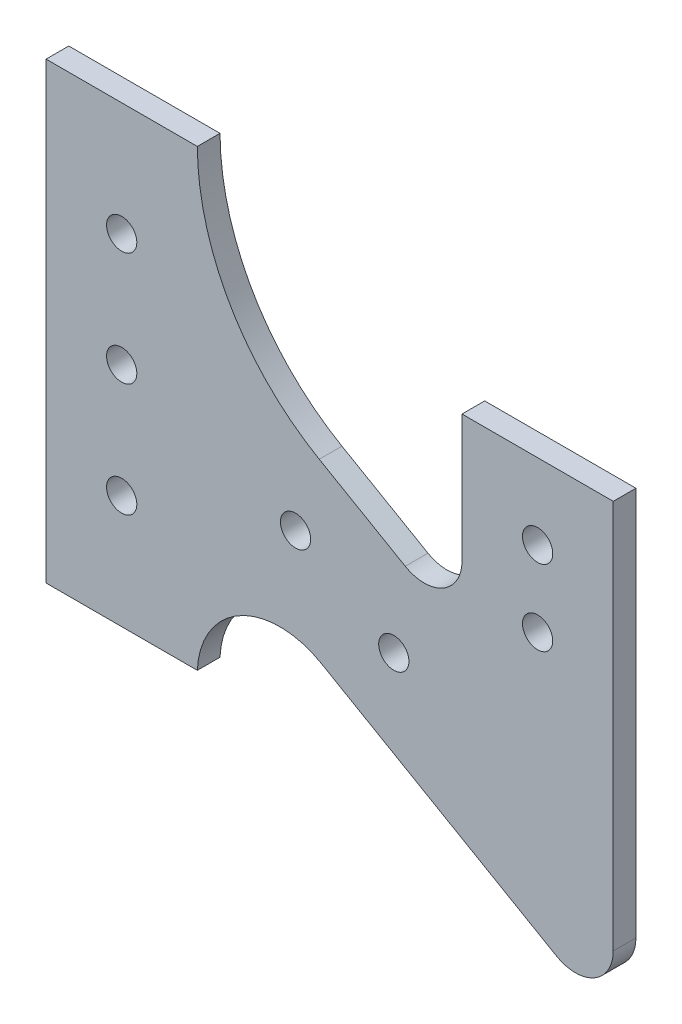
ISO-10303-21;
HEADER;
FILE_DESCRIPTION(('STEP AP214'),'2;1');
FILE_NAME('part.step','',(''),(''),'','','');
FILE_SCHEMA(('AUTOMOTIVE_DESIGN { 1 0 10303 214 1 1 1 1 }'));
ENDSEC;
DATA;
#1=APPLICATION_CONTEXT('core data for automotive mechanical design processes');
#2=APPLICATION_PROTOCOL_DEFINITION('international standard','automotive_design',2000,#1);
#3=PRODUCT_CONTEXT('',#1,'mechanical');
#4=PRODUCT('Part','Part','',(#3));
#5=PRODUCT_RELATED_PRODUCT_CATEGORY('part','',(#4));
#6=PRODUCT_DEFINITION_FORMATION('','',#4);
#7=PRODUCT_DEFINITION_CONTEXT('part definition',#1,'design');
#8=PRODUCT_DEFINITION('design','',#6,#7);
#9=PRODUCT_DEFINITION_SHAPE('','',#8);
#10=(LENGTH_UNIT() NAMED_UNIT(*) SI_UNIT(.MILLI.,.METRE.));
#11=(NAMED_UNIT(*) PLANE_ANGLE_UNIT() SI_UNIT($,.RADIAN.));
#12=(NAMED_UNIT(*) SI_UNIT($,.STERADIAN.) SOLID_ANGLE_UNIT());
#13=UNCERTAINTY_MEASURE_WITH_UNIT(LENGTH_MEASURE(1.E-05),#10,'distance_accuracy_value','');
#14=(GEOMETRIC_REPRESENTATION_CONTEXT(3) GLOBAL_UNCERTAINTY_ASSIGNED_CONTEXT((#13)) GLOBAL_UNIT_ASSIGNED_CONTEXT((#10,
#11,#12)) REPRESENTATION_CONTEXT('',''));
#15=CARTESIAN_POINT('',(0.,0.,0.));
#16=DIRECTION('',(0.,0.,1.));
#17=DIRECTION('',(1.,0.,0.));
#18=AXIS2_PLACEMENT_3D('',#15,#16,#17);
#19=CARTESIAN_POINT('',(-13.7193166542021,-22.5735942810793,3.));
#20=DIRECTION('',(0.,0.,1.));
#21=DIRECTION('',(1.,0.,0.));
#22=AXIS2_PLACEMENT_3D('',#19,#20,#21);
#23=PLANE('',#22);
#24=CARTESIAN_POINT('',(20.3600724177373,4.75741388935291,3.));
#25=DIRECTION('',(0.,0.,1.));
#26=DIRECTION('',(1.,0.,0.));
#27=AXIS2_PLACEMENT_3D('',#24,#25,#26);
#28=CIRCLE('',#27,2.);
#29=CARTESIAN_POINT('',(22.3600724177373,4.75741388935291,3.));
#30=VERTEX_POINT('',#29);
#31=EDGE_CURVE('E350',#30,#30,#28,.T.);
#32=ORIENTED_EDGE('',*,*,#31,.F.);
#33=EDGE_LOOP('',(#32));
#34=FACE_BOUND('',#33,.T.);
#35=CARTESIAN_POINT('',(-11.6495465254963,0.40033300889919,3.));
#36=DIRECTION('',(0.,0.,1.));
#37=DIRECTION('',(1.,0.,0.));
#38=AXIS2_PLACEMENT_3D('',#35,#36,#37);
#39=CIRCLE('',#38,2.00000000000002);
#40=CARTESIAN_POINT('',(-9.64954652549625,0.40033300889919,3.));
#41=VERTEX_POINT('',#40);
#42=EDGE_CURVE('E366',#41,#41,#39,.T.);
#43=ORIENTED_EDGE('',*,*,#42,.F.);
#44=EDGE_LOOP('',(#43));
#45=FACE_BOUND('',#44,.T.);
#46=CARTESIAN_POINT('',(-34.6399275822627,7.90033300889914,3.));
#47=DIRECTION('',(0.,0.,1.));
#48=DIRECTION('',(1.,0.,0.));
#49=AXIS2_PLACEMENT_3D('',#46,#47,#48);
#50=CIRCLE('',#49,2.);
#51=CARTESIAN_POINT('',(-32.6399275822627,7.90033300889914,3.));
#52=VERTEX_POINT('',#51);
#53=EDGE_CURVE('E382',#52,#52,#50,.T.);
#54=ORIENTED_EDGE('',*,*,#53,.F.);
#55=EDGE_LOOP('',(#54));
#56=FACE_BOUND('',#55,.T.);
#57=CARTESIAN_POINT('',(-13.7193166542021,-22.5735942810793,3.));
#58=DIRECTION('',(0.,0.,-1.));
#59=DIRECTION('',(1.,0.,0.));
#60=AXIS2_PLACEMENT_3D('',#57,#58,#59);
#61=CIRCLE('',#60,10.930889722171);
#62=CARTESIAN_POINT('',(-24.6399275822627,-22.0996669911008,3.));
#63=VERTEX_POINT('',#62);
#64=CARTESIAN_POINT('',(-8.25387179311665,-13.1071660957129,3.));
#65=VERTEX_POINT('',#64);
#66=EDGE_CURVE('E206',#63,#65,#61,.T.);
#67=ORIENTED_EDGE('',*,*,#66,.T.);
#68=DIRECTION('',(0.866025403784438,-0.500000000000002,0.));
#69=VECTOR('',#68,1.);
#70=CARTESIAN_POINT('',(-8.25387179311665,-13.1071660957129,3.));
#71=LINE('',#70,#69);
#72=CARTESIAN_POINT('',(22.8600724177373,-31.0708101614006,3.));
#73=VERTEX_POINT('',#72);
#74=EDGE_CURVE('E118',#65,#73,#71,.T.);
#75=ORIENTED_EDGE('',*,*,#74,.T.);
#76=CARTESIAN_POINT('',(25.3600724177373,-26.7406831424783,3.));
#77=DIRECTION('',(0.,0.,1.));
#78=DIRECTION('',(1.,0.,0.));
#79=AXIS2_PLACEMENT_3D('',#76,#77,#78);
#80=CIRCLE('',#79,5.00000000000001);
#81=CARTESIAN_POINT('',(30.3600724177373,-26.7406831424783,3.));
#82=VERTEX_POINT('',#81);
#83=EDGE_CURVE('E243',#73,#82,#80,.T.);
#84=ORIENTED_EDGE('',*,*,#83,.T.);
#85=DIRECTION('',(0.,1.,0.));
#86=VECTOR('',#85,1.);
#87=CARTESIAN_POINT('',(30.3600724177373,-26.7406831424783,3.));
#88=LINE('',#87,#86);
#89=CARTESIAN_POINT('',(30.3600724177373,24.7574138893528,3.));
#90=VERTEX_POINT('',#89);
#91=EDGE_CURVE('E263',#82,#90,#88,.T.);
#92=ORIENTED_EDGE('',*,*,#91,.T.);
#93=DIRECTION('',(-1.,0.,0.));
#94=VECTOR('',#93,1.);
#95=CARTESIAN_POINT('',(30.3600724177373,24.7574138893528,3.));
#96=LINE('',#95,#94);
#97=CARTESIAN_POINT('',(10.3600724177373,24.7574138893528,3.));
#98=VERTEX_POINT('',#97);
#99=EDGE_CURVE('E259',#90,#98,#96,.T.);
#100=ORIENTED_EDGE('',*,*,#99,.T.);
#101=DIRECTION('',(0.,-1.,0.));
#102=VECTOR('',#101,1.);
#103=CARTESIAN_POINT('',(10.3600724177373,24.7574138893528,3.));
#104=LINE('',#103,#102);
#105=CARTESIAN_POINT('',(10.3600724177373,7.90033300889903,3.));
#106=VERTEX_POINT('',#105);
#107=EDGE_CURVE('E262',#98,#106,#104,.T.);
#108=ORIENTED_EDGE('',*,*,#107,.T.);
#109=CARTESIAN_POINT('',(5.36007241773734,7.90033300889903,3.));
#110=DIRECTION('',(0.,0.,-1.));
#111=DIRECTION('',(1.,0.,0.));
#112=AXIS2_PLACEMENT_3D('',#109,#110,#111);
#113=CIRCLE('',#112,5.00000000000001);
#114=CARTESIAN_POINT('',(2.86007241773734,3.57020598997682,3.));
#115=VERTEX_POINT('',#114);
#116=EDGE_CURVE('E267',#106,#115,#113,.T.);
#117=ORIENTED_EDGE('',*,*,#116,.T.);
#118=DIRECTION('',(-0.866025403784438,0.500000000000001,0.));
#119=VECTOR('',#118,1.);
#120=CARTESIAN_POINT('',(2.86007241773734,3.57020598997682,3.));
#121=LINE('',#120,#119);
#122=CARTESIAN_POINT('',(-8.51472263148945,10.1374469736247,3.));
#123=VERTEX_POINT('',#122);
#124=EDGE_CURVE('E274',#115,#123,#121,.T.);
#125=ORIENTED_EDGE('',*,*,#124,.T.);
#126=CARTESIAN_POINT('',(7.61091750364393,38.0678749922478,3.));
#127=DIRECTION('',(0.,0.,-1.));
#128=DIRECTION('',(1.,0.,0.));
#129=AXIS2_PLACEMENT_3D('',#126,#127,#128);
#130=CIRCLE('',#129,32.2512802702671);
#131=CARTESIAN_POINT('',(-24.6399275822625,37.9003330088992,3.));
#132=VERTEX_POINT('',#131);
#133=EDGE_CURVE('E149',#123,#132,#130,.T.);
#134=ORIENTED_EDGE('',*,*,#133,.T.);
#135=DIRECTION('',(-1.,0.,0.));
#136=VECTOR('',#135,1.);
#137=CARTESIAN_POINT('',(-24.6399275822627,37.9003330088992,3.));
#138=LINE('',#137,#136);
#139=CARTESIAN_POINT('',(-44.6399275822627,37.9003330088992,3.));
#140=VERTEX_POINT('',#139);
#141=EDGE_CURVE('E143',#132,#140,#138,.T.);
#142=ORIENTED_EDGE('',*,*,#141,.T.);
#143=DIRECTION('',(0.,-1.,0.));
#144=VECTOR('',#143,1.);
#145=CARTESIAN_POINT('',(-44.6399275822627,37.9003330088992,3.));
#146=LINE('',#145,#144);
#147=CARTESIAN_POINT('',(-44.6399275822627,-22.0996669911008,3.));
#148=VERTEX_POINT('',#147);
#149=EDGE_CURVE('E147',#140,#148,#146,.T.);
#150=ORIENTED_EDGE('',*,*,#149,.T.);
#151=DIRECTION('',(1.,0.,0.));
#152=VECTOR('',#151,1.);
#153=CARTESIAN_POINT('',(-44.6399275822627,-22.0996669911008,3.));
#154=LINE('',#153,#152);
#155=EDGE_CURVE('E63',#148,#63,#154,.T.);
#156=ORIENTED_EDGE('',*,*,#155,.T.);
#157=EDGE_LOOP('',(#67,#75,#84,#92,#100,#108,#117,#125,#134,#142,#150,#156));
#158=FACE_BOUND('',#157,.T.);
#159=CARTESIAN_POINT('',(-34.6399275822627,22.9003330088992,3.));
#160=DIRECTION('',(0.,0.,1.));
#161=DIRECTION('',(1.,0.,0.));
#162=AXIS2_PLACEMENT_3D('',#159,#160,#161);
#163=CIRCLE('',#162,2.00000000000005);
#164=CARTESIAN_POINT('',(-32.6399275822626,22.9003330088992,3.));
#165=VERTEX_POINT('',#164);
#166=EDGE_CURVE('E176',#165,#165,#163,.T.);
#167=ORIENTED_EDGE('',*,*,#166,.F.);
#168=EDGE_LOOP('',(#167));
#169=FACE_BOUND('',#168,.T.);
#170=CARTESIAN_POINT('',(-34.6399275822627,-7.09966699110087,3.));
#171=DIRECTION('',(0.,0.,1.));
#172=DIRECTION('',(1.,0.,0.));
#173=AXIS2_PLACEMENT_3D('',#170,#171,#172);
#174=CIRCLE('',#173,2.);
#175=CARTESIAN_POINT('',(-32.6399275822627,-7.09966699110087,3.));
#176=VERTEX_POINT('',#175);
#177=EDGE_CURVE('E374',#176,#176,#174,.T.);
#178=ORIENTED_EDGE('',*,*,#177,.F.);
#179=EDGE_LOOP('',(#178));
#180=FACE_BOUND('',#179,.T.);
#181=CARTESIAN_POINT('',(1.34083453127035,-7.09966699110087,3.));
#182=DIRECTION('',(0.,0.,1.));
#183=DIRECTION('',(1.,0.,0.));
#184=AXIS2_PLACEMENT_3D('',#181,#182,#183);
#185=CIRCLE('',#184,2.);
#186=CARTESIAN_POINT('',(3.34083453127034,-7.09966699110087,3.));
#187=VERTEX_POINT('',#186);
#188=EDGE_CURVE('E358',#187,#187,#185,.T.);
#189=ORIENTED_EDGE('',*,*,#188,.F.);
#190=EDGE_LOOP('',(#189));
#191=FACE_BOUND('',#190,.T.);
#192=CARTESIAN_POINT('',(20.3600724177373,14.7574138893529,3.));
#193=DIRECTION('',(0.,0.,1.));
#194=DIRECTION('',(1.,0.,0.));
#195=AXIS2_PLACEMENT_3D('',#192,#193,#194);
#196=CIRCLE('',#195,2.00000000000002);
#197=CARTESIAN_POINT('',(22.3600724177373,14.7574138893529,3.));
#198=VERTEX_POINT('',#197);
#199=EDGE_CURVE('E339',#198,#198,#196,.T.);
#200=ORIENTED_EDGE('',*,*,#199,.F.);
#201=EDGE_LOOP('',(#200));
#202=FACE_BOUND('',#201,.T.);
#203=ADVANCED_FACE('F45',(#34,#45,#56,#158,#169,#180,#191,#202),#23,.T.);
#204=CARTESIAN_POINT('',(-13.7193166542021,-22.5735942810793,0.));
#205=DIRECTION('',(0.,0.,1.));
#206=DIRECTION('',(1.,0.,0.));
#207=AXIS2_PLACEMENT_3D('',#204,#205,#206);
#208=PLANE('',#207);
#209=CARTESIAN_POINT('',(-13.7193166542021,-22.5735942810793,0.));
#210=DIRECTION('',(0.,0.,-1.));
#211=DIRECTION('',(1.,0.,0.));
#212=AXIS2_PLACEMENT_3D('',#209,#210,#211);
#213=CIRCLE('',#212,10.930889722171);
#214=CARTESIAN_POINT('',(-24.6399275822627,-22.0996669911008,0.));
#215=VERTEX_POINT('',#214);
#216=CARTESIAN_POINT('',(-8.25387179311665,-13.1071660957129,0.));
#217=VERTEX_POINT('',#216);
#218=EDGE_CURVE('E171',#215,#217,#213,.T.);
#219=ORIENTED_EDGE('',*,*,#218,.F.);
#220=DIRECTION('',(1.,0.,0.));
#221=VECTOR('',#220,1.);
#222=CARTESIAN_POINT('',(-44.6399275822627,-22.0996669911008,0.));
#223=LINE('',#222,#221);
#224=CARTESIAN_POINT('',(-44.6399275822627,-22.0996669911008,0.));
#225=VERTEX_POINT('',#224);
#226=EDGE_CURVE('E110',#225,#215,#223,.T.);
#227=ORIENTED_EDGE('',*,*,#226,.F.);
#228=DIRECTION('',(0.,-1.,0.));
#229=VECTOR('',#228,1.);
#230=CARTESIAN_POINT('',(-44.6399275822627,37.9003330088992,0.));
#231=LINE('',#230,#229);
#232=CARTESIAN_POINT('',(-44.6399275822627,37.9003330088992,0.));
#233=VERTEX_POINT('',#232);
#234=EDGE_CURVE('E104',#233,#225,#231,.T.);
#235=ORIENTED_EDGE('',*,*,#234,.F.);
#236=DIRECTION('',(-1.,0.,0.));
#237=VECTOR('',#236,1.);
#238=CARTESIAN_POINT('',(-24.6399275822627,37.9003330088992,0.));
#239=LINE('',#238,#237);
#240=CARTESIAN_POINT('',(-24.6399275822625,37.9003330088992,0.));
#241=VERTEX_POINT('',#240);
#242=EDGE_CURVE('E158',#241,#233,#239,.T.);
#243=ORIENTED_EDGE('',*,*,#242,.F.);
#244=CARTESIAN_POINT('',(7.61091750364393,38.0678749922478,0.));
#245=DIRECTION('',(0.,0.,-1.));
#246=DIRECTION('',(1.,0.,0.));
#247=AXIS2_PLACEMENT_3D('',#244,#245,#246);
#248=CIRCLE('',#247,32.2512802702671);
#249=CARTESIAN_POINT('',(-8.51472263148945,10.1374469736247,0.));
#250=VERTEX_POINT('',#249);
#251=EDGE_CURVE('E197',#250,#241,#248,.T.);
#252=ORIENTED_EDGE('',*,*,#251,.F.);
#253=DIRECTION('',(-0.866025403784438,0.500000000000001,0.));
#254=VECTOR('',#253,1.);
#255=CARTESIAN_POINT('',(2.86007241773734,3.57020598997682,0.));
#256=LINE('',#255,#254);
#257=CARTESIAN_POINT('',(2.86007241773734,3.57020598997682,0.));
#258=VERTEX_POINT('',#257);
#259=EDGE_CURVE('E194',#258,#250,#256,.T.);
#260=ORIENTED_EDGE('',*,*,#259,.F.);
#261=CARTESIAN_POINT('',(5.36007241773734,7.90033300889903,0.));
#262=DIRECTION('',(0.,0.,-1.));
#263=DIRECTION('',(1.,0.,0.));
#264=AXIS2_PLACEMENT_3D('',#261,#262,#263);
#265=CIRCLE('',#264,5.00000000000001);
#266=CARTESIAN_POINT('',(10.3600724177373,7.90033300889903,0.));
#267=VERTEX_POINT('',#266);
#268=EDGE_CURVE('E191',#267,#258,#265,.T.);
#269=ORIENTED_EDGE('',*,*,#268,.F.);
#270=DIRECTION('',(0.,-1.,0.));
#271=VECTOR('',#270,1.);
#272=CARTESIAN_POINT('',(10.3600724177373,24.7574138893528,0.));
#273=LINE('',#272,#271);
#274=CARTESIAN_POINT('',(10.3600724177373,24.7574138893528,0.));
#275=VERTEX_POINT('',#274);
#276=EDGE_CURVE('E188',#275,#267,#273,.T.);
#277=ORIENTED_EDGE('',*,*,#276,.F.);
#278=DIRECTION('',(-1.,0.,0.));
#279=VECTOR('',#278,1.);
#280=CARTESIAN_POINT('',(30.3600724177373,24.7574138893528,0.));
#281=LINE('',#280,#279);
#282=CARTESIAN_POINT('',(30.3600724177373,24.7574138893528,0.));
#283=VERTEX_POINT('',#282);
#284=EDGE_CURVE('E185',#283,#275,#281,.T.);
#285=ORIENTED_EDGE('',*,*,#284,.F.);
#286=DIRECTION('',(0.,1.,0.));
#287=VECTOR('',#286,1.);
#288=CARTESIAN_POINT('',(30.3600724177373,-26.7406831424783,0.));
#289=LINE('',#288,#287);
#290=CARTESIAN_POINT('',(30.3600724177373,-26.7406831424783,0.));
#291=VERTEX_POINT('',#290);
#292=EDGE_CURVE('E182',#291,#283,#289,.T.);
#293=ORIENTED_EDGE('',*,*,#292,.F.);
#294=CARTESIAN_POINT('',(25.3600724177373,-26.7406831424783,0.));
#295=DIRECTION('',(0.,0.,1.));
#296=DIRECTION('',(1.,0.,0.));
#297=AXIS2_PLACEMENT_3D('',#294,#295,#296);
#298=CIRCLE('',#297,5.00000000000001);
#299=CARTESIAN_POINT('',(22.8600724177373,-31.0708101614006,0.));
#300=VERTEX_POINT('',#299);
#301=EDGE_CURVE('E179',#300,#291,#298,.T.);
#302=ORIENTED_EDGE('',*,*,#301,.F.);
#303=DIRECTION('',(0.866025403784438,-0.500000000000002,0.));
#304=VECTOR('',#303,1.);
#305=CARTESIAN_POINT('',(-8.25387179311665,-13.1071660957129,0.));
#306=LINE('',#305,#304);
#307=EDGE_CURVE('E175',#217,#300,#306,.T.);
#308=ORIENTED_EDGE('',*,*,#307,.F.);
#309=EDGE_LOOP('',(#219,#227,#235,#243,#252,#260,#269,#277,#285,#293,#302,#308));
#310=FACE_BOUND('',#309,.T.);
#311=CARTESIAN_POINT('',(-34.6399275822627,22.9003330088992,0.));
#312=DIRECTION('',(0.,0.,1.));
#313=DIRECTION('',(1.,0.,0.));
#314=AXIS2_PLACEMENT_3D('',#311,#312,#313);
#315=CIRCLE('',#314,2.00000000000005);
#316=CARTESIAN_POINT('',(-32.6399275822626,22.9003330088992,0.));
#317=VERTEX_POINT('',#316);
#318=EDGE_CURVE('E386',#317,#317,#315,.T.);
#319=ORIENTED_EDGE('',*,*,#318,.T.);
#320=EDGE_LOOP('',(#319));
#321=FACE_BOUND('',#320,.T.);
#322=CARTESIAN_POINT('',(-34.6399275822627,7.90033300889914,0.));
#323=DIRECTION('',(0.,0.,1.));
#324=DIRECTION('',(1.,0.,0.));
#325=AXIS2_PLACEMENT_3D('',#322,#323,#324);
#326=CIRCLE('',#325,2.);
#327=CARTESIAN_POINT('',(-32.6399275822627,7.90033300889914,0.));
#328=VERTEX_POINT('',#327);
#329=EDGE_CURVE('E378',#328,#328,#326,.T.);
#330=ORIENTED_EDGE('',*,*,#329,.T.);
#331=EDGE_LOOP('',(#330));
#332=FACE_BOUND('',#331,.T.);
#333=CARTESIAN_POINT('',(-34.6399275822627,-7.09966699110087,0.));
#334=DIRECTION('',(0.,0.,1.));
#335=DIRECTION('',(1.,0.,0.));
#336=AXIS2_PLACEMENT_3D('',#333,#334,#335);
#337=CIRCLE('',#336,2.);
#338=CARTESIAN_POINT('',(-32.6399275822627,-7.09966699110087,0.));
#339=VERTEX_POINT('',#338);
#340=EDGE_CURVE('E370',#339,#339,#337,.T.);
#341=ORIENTED_EDGE('',*,*,#340,.T.);
#342=EDGE_LOOP('',(#341));
#343=FACE_BOUND('',#342,.T.);
#344=CARTESIAN_POINT('',(-11.6495465254963,0.40033300889919,0.));
#345=DIRECTION('',(0.,0.,1.));
#346=DIRECTION('',(1.,0.,0.));
#347=AXIS2_PLACEMENT_3D('',#344,#345,#346);
#348=CIRCLE('',#347,2.00000000000002);
#349=CARTESIAN_POINT('',(-9.64954652549625,0.40033300889919,0.));
#350=VERTEX_POINT('',#349);
#351=EDGE_CURVE('E362',#350,#350,#348,.T.);
#352=ORIENTED_EDGE('',*,*,#351,.T.);
#353=EDGE_LOOP('',(#352));
#354=FACE_BOUND('',#353,.T.);
#355=CARTESIAN_POINT('',(1.34083453127035,-7.09966699110087,0.));
#356=DIRECTION('',(0.,0.,1.));
#357=DIRECTION('',(1.,0.,0.));
#358=AXIS2_PLACEMENT_3D('',#355,#356,#357);
#359=CIRCLE('',#358,2.);
#360=CARTESIAN_POINT('',(3.34083453127034,-7.09966699110087,0.));
#361=VERTEX_POINT('',#360);
#362=EDGE_CURVE('E354',#361,#361,#359,.T.);
#363=ORIENTED_EDGE('',*,*,#362,.T.);
#364=EDGE_LOOP('',(#363));
#365=FACE_BOUND('',#364,.T.);
#366=CARTESIAN_POINT('',(20.3600724177373,4.75741388935291,0.));
#367=DIRECTION('',(0.,0.,1.));
#368=DIRECTION('',(1.,0.,0.));
#369=AXIS2_PLACEMENT_3D('',#366,#367,#368);
#370=CIRCLE('',#369,2.);
#371=CARTESIAN_POINT('',(22.3600724177373,4.75741388935291,0.));
#372=VERTEX_POINT('',#371);
#373=EDGE_CURVE('E347',#372,#372,#370,.T.);
#374=ORIENTED_EDGE('',*,*,#373,.T.);
#375=EDGE_LOOP('',(#374));
#376=FACE_BOUND('',#375,.T.);
#377=CARTESIAN_POINT('',(20.3600724177373,14.7574138893529,0.));
#378=DIRECTION('',(0.,0.,1.));
#379=DIRECTION('',(1.,0.,0.));
#380=AXIS2_PLACEMENT_3D('',#377,#378,#379);
#381=CIRCLE('',#380,2.00000000000002);
#382=CARTESIAN_POINT('',(22.3600724177373,14.7574138893529,0.));
#383=VERTEX_POINT('',#382);
#384=EDGE_CURVE('E342',#383,#383,#381,.T.);
#385=ORIENTED_EDGE('',*,*,#384,.T.);
#386=EDGE_LOOP('',(#385));
#387=FACE_BOUND('',#386,.T.);
#388=ADVANCED_FACE('F247',(#310,#321,#332,#343,#354,#365,#376,#387),#208,.F.);
#389=CARTESIAN_POINT('',(-13.7193166542021,-22.5735942810793,3.));
#390=DIRECTION('',(0.,0.,-1.));
#391=DIRECTION('',(-1.,0.,0.));
#392=AXIS2_PLACEMENT_3D('',#389,#390,#391);
#393=CYLINDRICAL_SURFACE('',#392,10.930889722171);
#394=ORIENTED_EDGE('',*,*,#218,.T.);
#395=DIRECTION('',(0.,0.,-1.));
#396=VECTOR('',#395,1.);
#397=CARTESIAN_POINT('',(-8.25387179311665,-13.1071660957129,3.));
#398=LINE('',#397,#396);
#399=EDGE_CURVE('E11',#65,#217,#398,.T.);
#400=ORIENTED_EDGE('',*,*,#399,.F.);
#401=ORIENTED_EDGE('',*,*,#66,.F.);
#402=DIRECTION('',(0.,0.,-1.));
#403=VECTOR('',#402,1.);
#404=CARTESIAN_POINT('',(-24.6399275822627,-22.0996669911008,3.));
#405=LINE('',#404,#403);
#406=EDGE_CURVE('E167',#63,#215,#405,.T.);
#407=ORIENTED_EDGE('',*,*,#406,.T.);
#408=EDGE_LOOP('',(#394,#400,#401,#407));
#409=FACE_BOUND('',#408,.T.);
#410=ADVANCED_FACE('F47',(#409),#393,.F.);
#411=CARTESIAN_POINT('',(-8.25387179311665,-13.1071660957129,3.));
#412=DIRECTION('',(0.500000000000002,0.866025403784438,0.));
#413=DIRECTION('',(-0.866025403784438,0.500000000000002,0.));
#414=AXIS2_PLACEMENT_3D('',#411,#412,#413);
#415=PLANE('',#414);
#416=ORIENTED_EDGE('',*,*,#307,.T.);
#417=DIRECTION('',(0.,0.,-1.));
#418=VECTOR('',#417,1.);
#419=CARTESIAN_POINT('',(22.8600724177373,-31.0708101614006,3.));
#420=LINE('',#419,#418);
#421=EDGE_CURVE('E55',#73,#300,#420,.T.);
#422=ORIENTED_EDGE('',*,*,#421,.F.);
#423=ORIENTED_EDGE('',*,*,#74,.F.);
#424=ORIENTED_EDGE('',*,*,#399,.T.);
#425=EDGE_LOOP('',(#416,#422,#423,#424));
#426=FACE_BOUND('',#425,.T.);
#427=ADVANCED_FACE('F536',(#426),#415,.F.);
#428=CARTESIAN_POINT('',(25.3600724177373,-26.7406831424783,3.));
#429=DIRECTION('',(0.,0.,-1.));
#430=DIRECTION('',(-1.,0.,0.));
#431=AXIS2_PLACEMENT_3D('',#428,#429,#430);
#432=CYLINDRICAL_SURFACE('',#431,5.00000000000001);
#433=ORIENTED_EDGE('',*,*,#301,.T.);
#434=DIRECTION('',(0.,0.,-1.));
#435=VECTOR('',#434,1.);
#436=CARTESIAN_POINT('',(30.3600724177373,-26.7406831424783,3.));
#437=LINE('',#436,#435);
#438=EDGE_CURVE('E233',#82,#291,#437,.T.);
#439=ORIENTED_EDGE('',*,*,#438,.F.);
#440=ORIENTED_EDGE('',*,*,#83,.F.);
#441=ORIENTED_EDGE('',*,*,#421,.T.);
#442=EDGE_LOOP('',(#433,#439,#440,#441));
#443=FACE_BOUND('',#442,.T.);
#444=ADVANCED_FACE('F241',(#443),#432,.T.);
#445=CARTESIAN_POINT('',(30.3600724177373,-26.7406831424783,3.));
#446=DIRECTION('',(-1.,0.,0.));
#447=DIRECTION('',(0.,0.,1.));
#448=AXIS2_PLACEMENT_3D('',#445,#446,#447);
#449=PLANE('',#448);
#450=ORIENTED_EDGE('',*,*,#292,.T.);
#451=DIRECTION('',(0.,0.,-1.));
#452=VECTOR('',#451,1.);
#453=CARTESIAN_POINT('',(30.3600724177373,24.7574138893528,3.));
#454=LINE('',#453,#452);
#455=EDGE_CURVE('E229',#90,#283,#454,.T.);
#456=ORIENTED_EDGE('',*,*,#455,.F.);
#457=ORIENTED_EDGE('',*,*,#91,.F.);
#458=ORIENTED_EDGE('',*,*,#438,.T.);
#459=EDGE_LOOP('',(#450,#456,#457,#458));
#460=FACE_BOUND('',#459,.T.);
#461=ADVANCED_FACE('F253',(#460),#449,.F.);
#462=CARTESIAN_POINT('',(30.3600724177373,24.7574138893528,3.));
#463=DIRECTION('',(0.,-1.,0.));
#464=DIRECTION('',(0.,0.,-1.));
#465=AXIS2_PLACEMENT_3D('',#462,#463,#464);
#466=PLANE('',#465);
#467=ORIENTED_EDGE('',*,*,#284,.T.);
#468=DIRECTION('',(0.,0.,-1.));
#469=VECTOR('',#468,1.);
#470=CARTESIAN_POINT('',(10.3600724177373,24.7574138893528,3.));
#471=LINE('',#470,#469);
#472=EDGE_CURVE('E225',#98,#275,#471,.T.);
#473=ORIENTED_EDGE('',*,*,#472,.F.);
#474=ORIENTED_EDGE('',*,*,#99,.F.);
#475=ORIENTED_EDGE('',*,*,#455,.T.);
#476=EDGE_LOOP('',(#467,#473,#474,#475));
#477=FACE_BOUND('',#476,.T.);
#478=ADVANCED_FACE('F257',(#477),#466,.F.);
#479=CARTESIAN_POINT('',(10.3600724177373,24.7574138893528,3.));
#480=DIRECTION('',(1.,0.,0.));
#481=DIRECTION('',(0.,0.,-1.));
#482=AXIS2_PLACEMENT_3D('',#479,#480,#481);
#483=PLANE('',#482);
#484=ORIENTED_EDGE('',*,*,#276,.T.);
#485=DIRECTION('',(0.,0.,-1.));
#486=VECTOR('',#485,1.);
#487=CARTESIAN_POINT('',(10.3600724177373,7.90033300889903,3.));
#488=LINE('',#487,#486);
#489=EDGE_CURVE('E221',#106,#267,#488,.T.);
#490=ORIENTED_EDGE('',*,*,#489,.F.);
#491=ORIENTED_EDGE('',*,*,#107,.F.);
#492=ORIENTED_EDGE('',*,*,#472,.T.);
#493=EDGE_LOOP('',(#484,#490,#491,#492));
#494=FACE_BOUND('',#493,.T.);
#495=ADVANCED_FACE('F501',(#494),#483,.F.);
#496=CARTESIAN_POINT('',(5.36007241773734,7.90033300889903,3.));
#497=DIRECTION('',(0.,0.,-1.));
#498=DIRECTION('',(-1.,0.,0.));
#499=AXIS2_PLACEMENT_3D('',#496,#497,#498);
#500=CYLINDRICAL_SURFACE('',#499,5.00000000000001);
#501=ORIENTED_EDGE('',*,*,#268,.T.);
#502=DIRECTION('',(0.,0.,-1.));
#503=VECTOR('',#502,1.);
#504=CARTESIAN_POINT('',(2.86007241773734,3.57020598997682,3.));
#505=LINE('',#504,#503);
#506=EDGE_CURVE('E217',#115,#258,#505,.T.);
#507=ORIENTED_EDGE('',*,*,#506,.F.);
#508=ORIENTED_EDGE('',*,*,#116,.F.);
#509=ORIENTED_EDGE('',*,*,#489,.T.);
#510=EDGE_LOOP('',(#501,#507,#508,#509));
#511=FACE_BOUND('',#510,.T.);
#512=ADVANCED_FACE('F492',(#511),#500,.F.);
#513=CARTESIAN_POINT('',(2.86007241773734,3.57020598997682,3.));
#514=DIRECTION('',(-0.500000000000001,-0.866025403784438,0.));
#515=DIRECTION('',(0.866025403784438,-0.500000000000001,0.));
#516=AXIS2_PLACEMENT_3D('',#513,#514,#515);
#517=PLANE('',#516);
#518=ORIENTED_EDGE('',*,*,#259,.T.);
#519=DIRECTION('',(0.,0.,-1.));
#520=VECTOR('',#519,1.);
#521=CARTESIAN_POINT('',(-8.51472263148945,10.1374469736247,3.));
#522=LINE('',#521,#520);
#523=EDGE_CURVE('E213',#123,#250,#522,.T.);
#524=ORIENTED_EDGE('',*,*,#523,.F.);
#525=ORIENTED_EDGE('',*,*,#124,.F.);
#526=ORIENTED_EDGE('',*,*,#506,.T.);
#527=EDGE_LOOP('',(#518,#524,#525,#526));
#528=FACE_BOUND('',#527,.T.);
#529=ADVANCED_FACE('F282',(#528),#517,.F.);
#530=CARTESIAN_POINT('',(7.61091750364393,38.0678749922478,3.));
#531=DIRECTION('',(0.,0.,-1.));
#532=DIRECTION('',(-1.,0.,0.));
#533=AXIS2_PLACEMENT_3D('',#530,#531,#532);
#534=CYLINDRICAL_SURFACE('',#533,32.2512802702671);
#535=ORIENTED_EDGE('',*,*,#251,.T.);
#536=DIRECTION('',(0.,0.,-1.));
#537=VECTOR('',#536,1.);
#538=CARTESIAN_POINT('',(-24.6399275822625,37.9003330088992,3.));
#539=LINE('',#538,#537);
#540=EDGE_CURVE('E160',#132,#241,#539,.T.);
#541=ORIENTED_EDGE('',*,*,#540,.F.);
#542=ORIENTED_EDGE('',*,*,#133,.F.);
#543=ORIENTED_EDGE('',*,*,#523,.T.);
#544=EDGE_LOOP('',(#535,#541,#542,#543));
#545=FACE_BOUND('',#544,.T.);
#546=ADVANCED_FACE('F286',(#545),#534,.F.);
#547=CARTESIAN_POINT('',(-24.6399275822627,37.9003330088992,3.));
#548=DIRECTION('',(0.,-1.,0.));
#549=DIRECTION('',(0.,0.,-1.));
#550=AXIS2_PLACEMENT_3D('',#547,#548,#549);
#551=PLANE('',#550);
#552=ORIENTED_EDGE('',*,*,#242,.T.);
#553=DIRECTION('',(0.,0.,-1.));
#554=VECTOR('',#553,1.);
#555=CARTESIAN_POINT('',(-44.6399275822627,37.9003330088992,3.));
#556=LINE('',#555,#554);
#557=EDGE_CURVE('E155',#140,#233,#556,.T.);
#558=ORIENTED_EDGE('',*,*,#557,.F.);
#559=ORIENTED_EDGE('',*,*,#141,.F.);
#560=ORIENTED_EDGE('',*,*,#540,.T.);
#561=EDGE_LOOP('',(#552,#558,#559,#560));
#562=FACE_BOUND('',#561,.T.);
#563=ADVANCED_FACE('F156',(#562),#551,.F.);
#564=CARTESIAN_POINT('',(-44.6399275822627,37.9003330088992,3.));
#565=DIRECTION('',(1.,0.,0.));
#566=DIRECTION('',(0.,0.,-1.));
#567=AXIS2_PLACEMENT_3D('',#564,#565,#566);
#568=PLANE('',#567);
#569=ORIENTED_EDGE('',*,*,#234,.T.);
#570=DIRECTION('',(0.,0.,-1.));
#571=VECTOR('',#570,1.);
#572=CARTESIAN_POINT('',(-44.6399275822627,-22.0996669911008,3.));
#573=LINE('',#572,#571);
#574=EDGE_CURVE('E161',#148,#225,#573,.T.);
#575=ORIENTED_EDGE('',*,*,#574,.F.);
#576=ORIENTED_EDGE('',*,*,#149,.F.);
#577=ORIENTED_EDGE('',*,*,#557,.T.);
#578=EDGE_LOOP('',(#569,#575,#576,#577));
#579=FACE_BOUND('',#578,.T.);
#580=ADVANCED_FACE('F163',(#579),#568,.F.);
#581=CARTESIAN_POINT('',(-44.6399275822627,-22.0996669911008,3.));
#582=DIRECTION('',(0.,1.,0.));
#583=DIRECTION('',(0.,0.,1.));
#584=AXIS2_PLACEMENT_3D('',#581,#582,#583);
#585=PLANE('',#584);
#586=ORIENTED_EDGE('',*,*,#226,.T.);
#587=ORIENTED_EDGE('',*,*,#406,.F.);
#588=ORIENTED_EDGE('',*,*,#155,.F.);
#589=ORIENTED_EDGE('',*,*,#574,.T.);
#590=EDGE_LOOP('',(#586,#587,#588,#589));
#591=FACE_BOUND('',#590,.T.);
#592=ADVANCED_FACE('F290',(#591),#585,.F.);
#593=CARTESIAN_POINT('',(-34.6399275822627,22.9003330088992,3.));
#594=DIRECTION('',(0.,0.,-1.));
#595=DIRECTION('',(-1.,0.,0.));
#596=AXIS2_PLACEMENT_3D('',#593,#594,#595);
#597=CYLINDRICAL_SURFACE('',#596,2.00000000000005);
#598=ORIENTED_EDGE('',*,*,#166,.T.);
#599=EDGE_LOOP('',(#598));
#600=FACE_BOUND('',#599,.T.);
#601=ORIENTED_EDGE('',*,*,#318,.F.);
#602=EDGE_LOOP('',(#601));
#603=FACE_BOUND('',#602,.T.);
#604=ADVANCED_FACE('F292',(#600,#603),#597,.F.);
#605=CARTESIAN_POINT('',(-34.6399275822627,7.90033300889914,3.));
#606=DIRECTION('',(0.,0.,-1.));
#607=DIRECTION('',(-1.,0.,0.));
#608=AXIS2_PLACEMENT_3D('',#605,#606,#607);
#609=CYLINDRICAL_SURFACE('',#608,2.);
#610=ORIENTED_EDGE('',*,*,#53,.T.);
#611=EDGE_LOOP('',(#610));
#612=FACE_BOUND('',#611,.T.);
#613=ORIENTED_EDGE('',*,*,#329,.F.);
#614=EDGE_LOOP('',(#613));
#615=FACE_BOUND('',#614,.T.);
#616=ADVANCED_FACE('F298',(#612,#615),#609,.F.);
#617=CARTESIAN_POINT('',(-34.6399275822627,-7.09966699110087,3.));
#618=DIRECTION('',(0.,0.,-1.));
#619=DIRECTION('',(-1.,0.,0.));
#620=AXIS2_PLACEMENT_3D('',#617,#618,#619);
#621=CYLINDRICAL_SURFACE('',#620,2.);
#622=ORIENTED_EDGE('',*,*,#177,.T.);
#623=EDGE_LOOP('',(#622));
#624=FACE_BOUND('',#623,.T.);
#625=ORIENTED_EDGE('',*,*,#340,.F.);
#626=EDGE_LOOP('',(#625));
#627=FACE_BOUND('',#626,.T.);
#628=ADVANCED_FACE('F314',(#624,#627),#621,.F.);
#629=CARTESIAN_POINT('',(-11.6495465254963,0.40033300889919,3.));
#630=DIRECTION('',(0.,0.,-1.));
#631=DIRECTION('',(-1.,0.,0.));
#632=AXIS2_PLACEMENT_3D('',#629,#630,#631);
#633=CYLINDRICAL_SURFACE('',#632,2.00000000000002);
#634=ORIENTED_EDGE('',*,*,#42,.T.);
#635=EDGE_LOOP('',(#634));
#636=FACE_BOUND('',#635,.T.);
#637=ORIENTED_EDGE('',*,*,#351,.F.);
#638=EDGE_LOOP('',(#637));
#639=FACE_BOUND('',#638,.T.);
#640=ADVANCED_FACE('F318',(#636,#639),#633,.F.);
#641=CARTESIAN_POINT('',(1.34083453127035,-7.09966699110087,3.));
#642=DIRECTION('',(0.,0.,-1.));
#643=DIRECTION('',(-1.,0.,0.));
#644=AXIS2_PLACEMENT_3D('',#641,#642,#643);
#645=CYLINDRICAL_SURFACE('',#644,2.);
#646=ORIENTED_EDGE('',*,*,#188,.T.);
#647=EDGE_LOOP('',(#646));
#648=FACE_BOUND('',#647,.T.);
#649=ORIENTED_EDGE('',*,*,#362,.F.);
#650=EDGE_LOOP('',(#649));
#651=FACE_BOUND('',#650,.T.);
#652=ADVANCED_FACE('F322',(#648,#651),#645,.F.);
#653=CARTESIAN_POINT('',(20.3600724177373,4.75741388935291,3.));
#654=DIRECTION('',(0.,0.,-1.));
#655=DIRECTION('',(-1.,0.,0.));
#656=AXIS2_PLACEMENT_3D('',#653,#654,#655);
#657=CYLINDRICAL_SURFACE('',#656,2.);
#658=ORIENTED_EDGE('',*,*,#31,.T.);
#659=EDGE_LOOP('',(#658));
#660=FACE_BOUND('',#659,.T.);
#661=ORIENTED_EDGE('',*,*,#373,.F.);
#662=EDGE_LOOP('',(#661));
#663=FACE_BOUND('',#662,.T.);
#664=ADVANCED_FACE('F326',(#660,#663),#657,.F.);
#665=CARTESIAN_POINT('',(20.3600724177373,14.7574138893529,3.));
#666=DIRECTION('',(0.,0.,-1.));
#667=DIRECTION('',(-1.,0.,0.));
#668=AXIS2_PLACEMENT_3D('',#665,#666,#667);
#669=CYLINDRICAL_SURFACE('',#668,2.00000000000002);
#670=ORIENTED_EDGE('',*,*,#199,.T.);
#671=EDGE_LOOP('',(#670));
#672=FACE_BOUND('',#671,.T.);
#673=ORIENTED_EDGE('',*,*,#384,.F.);
#674=EDGE_LOOP('',(#673));
#675=FACE_BOUND('',#674,.T.);
#676=ADVANCED_FACE('F330',(#672,#675),#669,.F.);
#677=CLOSED_SHELL('',(#203,#388,#410,#427,#444,#461,#478,#495,#512,#529,#546,#563,#580,#592,
#604,#616,#628,#640,#652,#664,#676));
#678=MANIFOLD_SOLID_BREP('B2',#677);
#679=ADVANCED_BREP_SHAPE_REPRESENTATION('',(#18,#678),#14);
#680=SHAPE_DEFINITION_REPRESENTATION(#9,#679);
ENDSEC;
END-ISO-10303-21;
